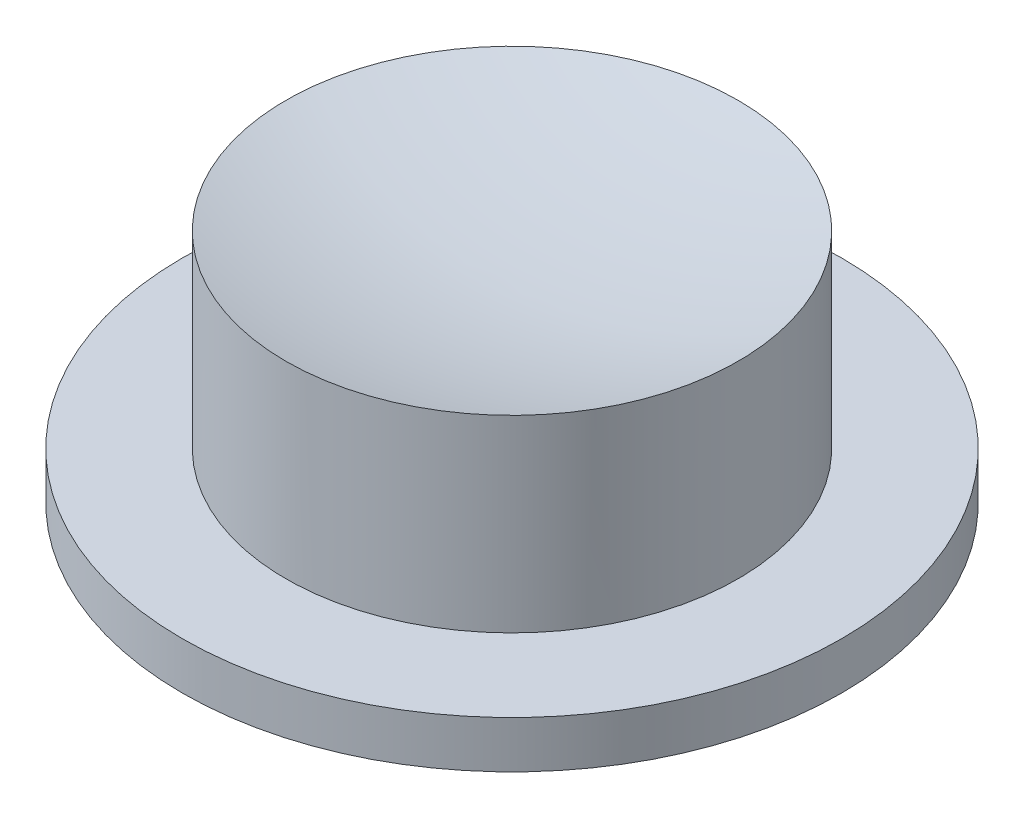
ISO-10303-21;
HEADER;
FILE_DESCRIPTION(('STEP AP214'),'2;1');
FILE_NAME('part.step','',(''),(''),'','','');
FILE_SCHEMA(('AUTOMOTIVE_DESIGN { 1 0 10303 214 1 1 1 1 }'));
ENDSEC;
DATA;
#1=APPLICATION_CONTEXT('core data for automotive mechanical design processes');
#2=APPLICATION_PROTOCOL_DEFINITION('international standard','automotive_design',2000,#1);
#3=PRODUCT_CONTEXT('',#1,'mechanical');
#4=PRODUCT('Part','Part','',(#3));
#5=PRODUCT_RELATED_PRODUCT_CATEGORY('part','',(#4));
#6=PRODUCT_DEFINITION_FORMATION('','',#4);
#7=PRODUCT_DEFINITION_CONTEXT('part definition',#1,'design');
#8=PRODUCT_DEFINITION('design','',#6,#7);
#9=PRODUCT_DEFINITION_SHAPE('','',#8);
#10=(LENGTH_UNIT() NAMED_UNIT(*) SI_UNIT(.MILLI.,.METRE.));
#11=(NAMED_UNIT(*) PLANE_ANGLE_UNIT() SI_UNIT($,.RADIAN.));
#12=(NAMED_UNIT(*) SI_UNIT($,.STERADIAN.) SOLID_ANGLE_UNIT());
#13=UNCERTAINTY_MEASURE_WITH_UNIT(LENGTH_MEASURE(1.E-05),#10,'distance_accuracy_value','');
#14=(GEOMETRIC_REPRESENTATION_CONTEXT(3) GLOBAL_UNCERTAINTY_ASSIGNED_CONTEXT((#13)) GLOBAL_UNIT_ASSIGNED_CONTEXT((#10,
#11,#12)) REPRESENTATION_CONTEXT('',''));
#15=CARTESIAN_POINT('',(0.,0.,0.));
#16=DIRECTION('',(0.,0.,1.));
#17=DIRECTION('',(1.,0.,0.));
#18=AXIS2_PLACEMENT_3D('',#15,#16,#17);
#19=CARTESIAN_POINT('',(0.,2.5,0.));
#20=DIRECTION('',(0.,-1.,0.));
#21=DIRECTION('',(0.,0.,-1.));
#22=AXIS2_PLACEMENT_3D('',#19,#20,#21);
#23=CYLINDRICAL_SURFACE('',#22,2.4);
#24=CARTESIAN_POINT('',(0.,2.5,0.));
#25=DIRECTION('',(0.,-1.,0.));
#26=DIRECTION('',(0.,0.,-1.));
#27=AXIS2_PLACEMENT_3D('',#24,#25,#26);
#28=CIRCLE('',#27,2.4);
#29=CARTESIAN_POINT('',(0.,2.5,-2.4));
#30=VERTEX_POINT('',#29);
#31=EDGE_CURVE('E37',#30,#30,#28,.T.);
#32=ORIENTED_EDGE('',*,*,#31,.T.);
#33=EDGE_LOOP('',(#32));
#34=FACE_BOUND('',#33,.T.);
#35=CARTESIAN_POINT('',(0.,0.5,0.));
#36=DIRECTION('',(0.,-1.,0.));
#37=DIRECTION('',(0.,0.,-1.));
#38=AXIS2_PLACEMENT_3D('',#35,#36,#37);
#39=CIRCLE('',#38,2.4);
#40=CARTESIAN_POINT('',(0.,0.5,-2.4));
#41=VERTEX_POINT('',#40);
#42=EDGE_CURVE('E10',#41,#41,#39,.T.);
#43=ORIENTED_EDGE('',*,*,#42,.F.);
#44=EDGE_LOOP('',(#43));
#45=FACE_BOUND('',#44,.T.);
#46=ADVANCED_FACE('F31',(#34,#45),#23,.T.);
#47=CARTESIAN_POINT('',(0.,10.5305666051655,0.));
#48=DIRECTION('',(0.,-1.,0.));
#49=DIRECTION('',(0.,0.,1.));
#50=AXIS2_PLACEMENT_3D('',#47,#48,#49);
#51=SPHERICAL_SURFACE('',#50,8.38152730712011);
#52=ORIENTED_EDGE('',*,*,#31,.F.);
#53=EDGE_LOOP('',(#52));
#54=FACE_BOUND('',#53,.T.);
#55=ADVANCED_FACE('F56',(#54),#51,.F.);
#56=CARTESIAN_POINT('',(0.,0.5,0.));
#57=DIRECTION('',(0.,-1.,0.));
#58=DIRECTION('',(0.,0.,-1.));
#59=AXIS2_PLACEMENT_3D('',#56,#57,#58);
#60=CYLINDRICAL_SURFACE('',#59,3.5);
#61=CARTESIAN_POINT('',(0.,0.5,0.));
#62=DIRECTION('',(0.,-1.,0.));
#63=DIRECTION('',(0.,0.,-1.));
#64=AXIS2_PLACEMENT_3D('',#61,#62,#63);
#65=CIRCLE('',#64,3.5);
#66=CARTESIAN_POINT('',(0.,0.5,-3.5));
#67=VERTEX_POINT('',#66);
#68=EDGE_CURVE('E41',#67,#67,#65,.T.);
#69=ORIENTED_EDGE('',*,*,#68,.T.);
#70=EDGE_LOOP('',(#69));
#71=FACE_BOUND('',#70,.T.);
#72=CARTESIAN_POINT('',(0.,0.,0.));
#73=DIRECTION('',(0.,-1.,0.));
#74=DIRECTION('',(0.,0.,-1.));
#75=AXIS2_PLACEMENT_3D('',#72,#73,#74);
#76=CIRCLE('',#75,3.5);
#77=CARTESIAN_POINT('',(0.,0.,-3.5));
#78=VERTEX_POINT('',#77);
#79=EDGE_CURVE('E45',#78,#78,#76,.T.);
#80=ORIENTED_EDGE('',*,*,#79,.F.);
#81=EDGE_LOOP('',(#80));
#82=FACE_BOUND('',#81,.T.);
#83=ADVANCED_FACE('F53',(#71,#82),#60,.T.);
#84=CARTESIAN_POINT('',(0.,0.5,0.));
#85=DIRECTION('',(0.,-1.,0.));
#86=DIRECTION('',(0.,0.,-1.));
#87=AXIS2_PLACEMENT_3D('',#84,#85,#86);
#88=PLANE('',#87);
#89=ORIENTED_EDGE('',*,*,#42,.T.);
#90=EDGE_LOOP('',(#89));
#91=FACE_BOUND('',#90,.T.);
#92=ORIENTED_EDGE('',*,*,#68,.F.);
#93=EDGE_LOOP('',(#92));
#94=FACE_BOUND('',#93,.T.);
#95=ADVANCED_FACE('F55',(#91,#94),#88,.F.);
#96=CARTESIAN_POINT('',(0.,0.,0.));
#97=DIRECTION('',(0.,1.,0.));
#98=DIRECTION('',(0.,0.,1.));
#99=AXIS2_PLACEMENT_3D('',#96,#97,#98);
#100=PLANE('',#99);
#101=ORIENTED_EDGE('',*,*,#79,.T.);
#102=EDGE_LOOP('',(#101));
#103=FACE_BOUND('',#102,.T.);
#104=ADVANCED_FACE('F51',(#103),#100,.F.);
#105=CLOSED_SHELL('',(#46,#55,#83,#95,#104));
#106=MANIFOLD_SOLID_BREP('B2',#105);
#107=ADVANCED_BREP_SHAPE_REPRESENTATION('',(#18,#106),#14);
#108=SHAPE_DEFINITION_REPRESENTATION(#9,#107);
ENDSEC;
END-ISO-10303-21;
